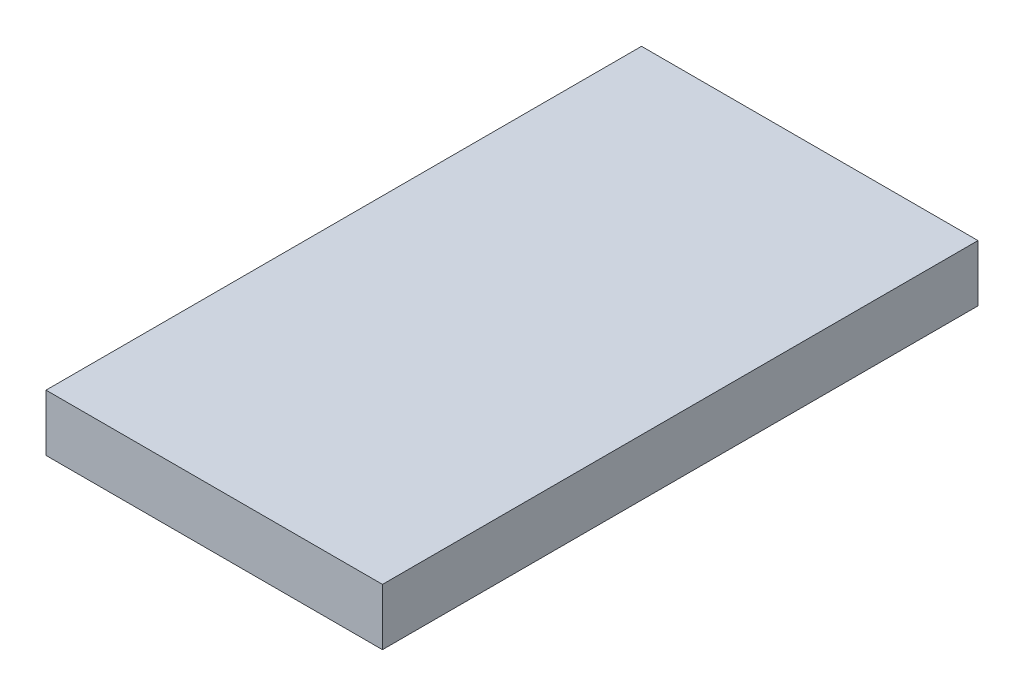
ISO-10303-21;
HEADER;
FILE_DESCRIPTION(('STEP AP214'),'2;1');
FILE_NAME('part.step','',(''),(''),'','','');
FILE_SCHEMA(('AUTOMOTIVE_DESIGN { 1 0 10303 214 1 1 1 1 }'));
ENDSEC;
DATA;
#1=APPLICATION_CONTEXT('core data for automotive mechanical design processes');
#2=APPLICATION_PROTOCOL_DEFINITION('international standard','automotive_design',2000,#1);
#3=PRODUCT_CONTEXT('',#1,'mechanical');
#4=PRODUCT('Part','Part','',(#3));
#5=PRODUCT_RELATED_PRODUCT_CATEGORY('part','',(#4));
#6=PRODUCT_DEFINITION_FORMATION('','',#4);
#7=PRODUCT_DEFINITION_CONTEXT('part definition',#1,'design');
#8=PRODUCT_DEFINITION('design','',#6,#7);
#9=PRODUCT_DEFINITION_SHAPE('','',#8);
#10=(LENGTH_UNIT() NAMED_UNIT(*) SI_UNIT(.MILLI.,.METRE.));
#11=(NAMED_UNIT(*) PLANE_ANGLE_UNIT() SI_UNIT($,.RADIAN.));
#12=(NAMED_UNIT(*) SI_UNIT($,.STERADIAN.) SOLID_ANGLE_UNIT());
#13=UNCERTAINTY_MEASURE_WITH_UNIT(LENGTH_MEASURE(1.E-05),#10,'distance_accuracy_value','');
#14=(GEOMETRIC_REPRESENTATION_CONTEXT(3) GLOBAL_UNCERTAINTY_ASSIGNED_CONTEXT((#13)) GLOBAL_UNIT_ASSIGNED_CONTEXT((#10,
#11,#12)) REPRESENTATION_CONTEXT('',''));
#15=CARTESIAN_POINT('',(0.,0.,0.));
#16=DIRECTION('',(0.,0.,1.));
#17=DIRECTION('',(1.,0.,0.));
#18=AXIS2_PLACEMENT_3D('',#15,#16,#17);
#19=CARTESIAN_POINT('',(33.4568627450981,21.2980392156863,100.));
#20=DIRECTION('',(0.,1.,0.));
#21=DIRECTION('',(-1.,0.,0.));
#22=AXIS2_PLACEMENT_3D('',#19,#20,#21);
#23=PLANE('',#22);
#24=DIRECTION('',(1.,0.,0.));
#25=VECTOR('',#24,1.);
#26=CARTESIAN_POINT('',(33.4568627450981,21.2980392156863,0.));
#27=LINE('',#26,#25);
#28=CARTESIAN_POINT('',(-23.0431372549019,21.2980392156863,0.));
#29=VERTEX_POINT('',#28);
#30=CARTESIAN_POINT('',(33.4568627450981,21.2980392156863,0.));
#31=VERTEX_POINT('',#30);
#32=EDGE_CURVE('E113',#29,#31,#27,.T.);
#33=ORIENTED_EDGE('',*,*,#32,.T.);
#34=DIRECTION('',(0.,0.,-1.));
#35=VECTOR('',#34,1.);
#36=CARTESIAN_POINT('',(33.4568627450981,21.2980392156863,100.));
#37=LINE('',#36,#35);
#38=CARTESIAN_POINT('',(33.4568627450981,21.2980392156863,100.));
#39=VERTEX_POINT('',#38);
#40=EDGE_CURVE('E11',#39,#31,#37,.T.);
#41=ORIENTED_EDGE('',*,*,#40,.F.);
#42=DIRECTION('',(1.,0.,0.));
#43=VECTOR('',#42,1.);
#44=CARTESIAN_POINT('',(33.4568627450981,21.2980392156863,100.));
#45=LINE('',#44,#43);
#46=CARTESIAN_POINT('',(-23.0431372549019,21.2980392156863,100.));
#47=VERTEX_POINT('',#46);
#48=EDGE_CURVE('E97',#47,#39,#45,.T.);
#49=ORIENTED_EDGE('',*,*,#48,.F.);
#50=DIRECTION('',(0.,0.,-1.));
#51=VECTOR('',#50,1.);
#52=CARTESIAN_POINT('',(-23.0431372549019,21.2980392156863,100.));
#53=LINE('',#52,#51);
#54=EDGE_CURVE('E109',#47,#29,#53,.T.);
#55=ORIENTED_EDGE('',*,*,#54,.T.);
#56=EDGE_LOOP('',(#33,#41,#49,#55));
#57=FACE_BOUND('',#56,.T.);
#58=ADVANCED_FACE('F45',(#57),#23,.F.);
#59=CARTESIAN_POINT('',(33.4568627450981,30.7980392156863,100.));
#60=DIRECTION('',(-1.,0.,0.));
#61=DIRECTION('',(0.,0.,1.));
#62=AXIS2_PLACEMENT_3D('',#59,#60,#61);
#63=PLANE('',#62);
#64=DIRECTION('',(0.,1.,0.));
#65=VECTOR('',#64,1.);
#66=CARTESIAN_POINT('',(33.4568627450981,30.7980392156863,0.));
#67=LINE('',#66,#65);
#68=CARTESIAN_POINT('',(33.4568627450981,30.7980392156863,0.));
#69=VERTEX_POINT('',#68);
#70=EDGE_CURVE('E102',#31,#69,#67,.T.);
#71=ORIENTED_EDGE('',*,*,#70,.T.);
#72=DIRECTION('',(0.,0.,-1.));
#73=VECTOR('',#72,1.);
#74=CARTESIAN_POINT('',(33.4568627450981,30.7980392156863,100.));
#75=LINE('',#74,#73);
#76=CARTESIAN_POINT('',(33.4568627450981,30.7980392156863,100.));
#77=VERTEX_POINT('',#76);
#78=EDGE_CURVE('E54',#77,#69,#75,.T.);
#79=ORIENTED_EDGE('',*,*,#78,.F.);
#80=DIRECTION('',(0.,1.,0.));
#81=VECTOR('',#80,1.);
#82=CARTESIAN_POINT('',(33.4568627450981,30.7980392156863,100.));
#83=LINE('',#82,#81);
#84=EDGE_CURVE('E92',#39,#77,#83,.T.);
#85=ORIENTED_EDGE('',*,*,#84,.F.);
#86=ORIENTED_EDGE('',*,*,#40,.T.);
#87=EDGE_LOOP('',(#71,#79,#85,#86));
#88=FACE_BOUND('',#87,.T.);
#89=ADVANCED_FACE('F101',(#88),#63,.F.);
#90=CARTESIAN_POINT('',(-23.0431372549019,30.7980392156863,100.));
#91=DIRECTION('',(0.,-1.,0.));
#92=DIRECTION('',(0.,0.,-1.));
#93=AXIS2_PLACEMENT_3D('',#90,#91,#92);
#94=PLANE('',#93);
#95=DIRECTION('',(-1.,0.,0.));
#96=VECTOR('',#95,1.);
#97=CARTESIAN_POINT('',(-23.0431372549019,30.7980392156863,0.));
#98=LINE('',#97,#96);
#99=CARTESIAN_POINT('',(-23.0431372549019,30.7980392156863,0.));
#100=VERTEX_POINT('',#99);
#101=EDGE_CURVE('E79',#69,#100,#98,.T.);
#102=ORIENTED_EDGE('',*,*,#101,.T.);
#103=DIRECTION('',(0.,0.,-1.));
#104=VECTOR('',#103,1.);
#105=CARTESIAN_POINT('',(-23.0431372549019,30.7980392156863,100.));
#106=LINE('',#105,#104);
#107=CARTESIAN_POINT('',(-23.0431372549019,30.7980392156863,100.));
#108=VERTEX_POINT('',#107);
#109=EDGE_CURVE('E104',#108,#100,#106,.T.);
#110=ORIENTED_EDGE('',*,*,#109,.F.);
#111=DIRECTION('',(-1.,0.,0.));
#112=VECTOR('',#111,1.);
#113=CARTESIAN_POINT('',(-23.0431372549019,30.7980392156863,100.));
#114=LINE('',#113,#112);
#115=EDGE_CURVE('E95',#77,#108,#114,.T.);
#116=ORIENTED_EDGE('',*,*,#115,.F.);
#117=ORIENTED_EDGE('',*,*,#78,.T.);
#118=EDGE_LOOP('',(#102,#110,#116,#117));
#119=FACE_BOUND('',#118,.T.);
#120=ADVANCED_FACE('F105',(#119),#94,.F.);
#121=CARTESIAN_POINT('',(-23.0431372549019,21.2980392156863,100.));
#122=DIRECTION('',(1.,0.,0.));
#123=DIRECTION('',(0.,0.,-1.));
#124=AXIS2_PLACEMENT_3D('',#121,#122,#123);
#125=PLANE('',#124);
#126=DIRECTION('',(0.,-1.,0.));
#127=VECTOR('',#126,1.);
#128=CARTESIAN_POINT('',(-23.0431372549019,21.2980392156863,0.));
#129=LINE('',#128,#127);
#130=EDGE_CURVE('E85',#100,#29,#129,.T.);
#131=ORIENTED_EDGE('',*,*,#130,.T.);
#132=ORIENTED_EDGE('',*,*,#54,.F.);
#133=DIRECTION('',(0.,-1.,0.));
#134=VECTOR('',#133,1.);
#135=CARTESIAN_POINT('',(-23.0431372549019,21.2980392156863,100.));
#136=LINE('',#135,#134);
#137=EDGE_CURVE('E62',#108,#47,#136,.T.);
#138=ORIENTED_EDGE('',*,*,#137,.F.);
#139=ORIENTED_EDGE('',*,*,#109,.T.);
#140=EDGE_LOOP('',(#131,#132,#138,#139));
#141=FACE_BOUND('',#140,.T.);
#142=ADVANCED_FACE('F126',(#141),#125,.F.);
#143=CARTESIAN_POINT('',(0.,0.,100.));
#144=DIRECTION('',(0.,0.,-1.));
#145=DIRECTION('',(-1.,0.,0.));
#146=AXIS2_PLACEMENT_3D('',#143,#144,#145);
#147=PLANE('',#146);
#148=ORIENTED_EDGE('',*,*,#48,.T.);
#149=ORIENTED_EDGE('',*,*,#84,.T.);
#150=ORIENTED_EDGE('',*,*,#115,.T.);
#151=ORIENTED_EDGE('',*,*,#137,.T.);
#152=EDGE_LOOP('',(#148,#149,#150,#151));
#153=FACE_BOUND('',#152,.T.);
#154=ADVANCED_FACE('F93',(#153),#147,.F.);
#155=CARTESIAN_POINT('',(0.,0.,0.));
#156=DIRECTION('',(0.,0.,-1.));
#157=DIRECTION('',(-1.,0.,0.));
#158=AXIS2_PLACEMENT_3D('',#155,#156,#157);
#159=PLANE('',#158);
#160=ORIENTED_EDGE('',*,*,#32,.F.);
#161=ORIENTED_EDGE('',*,*,#130,.F.);
#162=ORIENTED_EDGE('',*,*,#101,.F.);
#163=ORIENTED_EDGE('',*,*,#70,.F.);
#164=EDGE_LOOP('',(#160,#161,#162,#163));
#165=FACE_BOUND('',#164,.T.);
#166=ADVANCED_FACE('F129',(#165),#159,.T.);
#167=CLOSED_SHELL('',(#58,#89,#120,#142,#154,#166));
#168=MANIFOLD_SOLID_BREP('B2',#167);
#169=ADVANCED_BREP_SHAPE_REPRESENTATION('',(#18,#168),#14);
#170=SHAPE_DEFINITION_REPRESENTATION(#9,#169);
ENDSEC;
END-ISO-10303-21;
